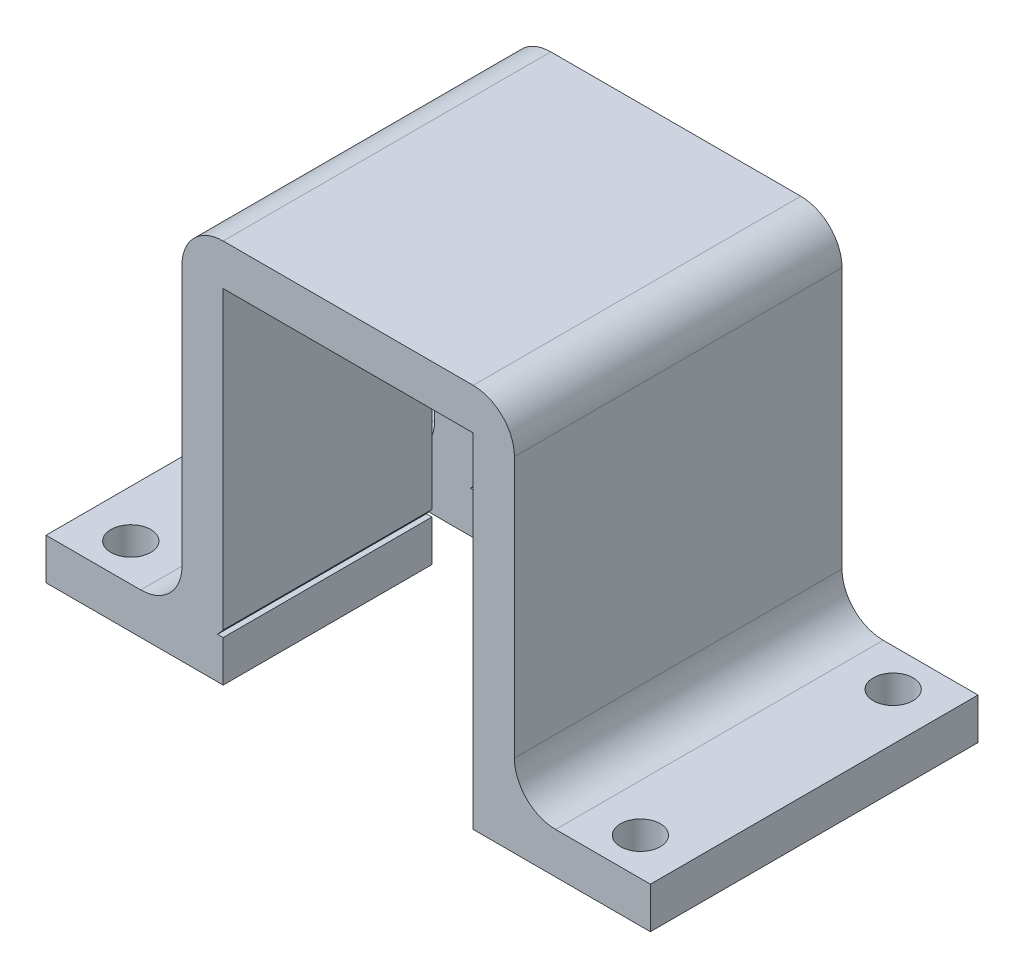
ISO-10303-21;
HEADER;
FILE_DESCRIPTION(('STEP AP214'),'2;1');
FILE_NAME('part.step','',(''),(''),'','','');
FILE_SCHEMA(('AUTOMOTIVE_DESIGN { 1 0 10303 214 1 1 1 1 }'));
ENDSEC;
DATA;
#1=APPLICATION_CONTEXT('core data for automotive mechanical design processes');
#2=APPLICATION_PROTOCOL_DEFINITION('international standard','automotive_design',2000,#1);
#3=PRODUCT_CONTEXT('',#1,'mechanical');
#4=PRODUCT('Part','Part','',(#3));
#5=PRODUCT_RELATED_PRODUCT_CATEGORY('part','',(#4));
#6=PRODUCT_DEFINITION_FORMATION('','',#4);
#7=PRODUCT_DEFINITION_CONTEXT('part definition',#1,'design');
#8=PRODUCT_DEFINITION('design','',#6,#7);
#9=PRODUCT_DEFINITION_SHAPE('','',#8);
#10=(LENGTH_UNIT() NAMED_UNIT(*) SI_UNIT(.MILLI.,.METRE.));
#11=(NAMED_UNIT(*) PLANE_ANGLE_UNIT() SI_UNIT($,.RADIAN.));
#12=(NAMED_UNIT(*) SI_UNIT($,.STERADIAN.) SOLID_ANGLE_UNIT());
#13=UNCERTAINTY_MEASURE_WITH_UNIT(LENGTH_MEASURE(1.E-05),#10,'distance_accuracy_value','');
#14=(GEOMETRIC_REPRESENTATION_CONTEXT(3) GLOBAL_UNCERTAINTY_ASSIGNED_CONTEXT((#13)) GLOBAL_UNIT_ASSIGNED_CONTEXT((#10,
#11,#12)) REPRESENTATION_CONTEXT('',''));
#15=CARTESIAN_POINT('',(0.,0.,0.));
#16=DIRECTION('',(0.,0.,1.));
#17=DIRECTION('',(1.,0.,0.));
#18=AXIS2_PLACEMENT_3D('',#15,#16,#17);
#19=CARTESIAN_POINT('',(0.,-11.,23.85));
#20=DIRECTION('',(0.,1.,0.));
#21=DIRECTION('',(-1.,0.,0.));
#22=AXIS2_PLACEMENT_3D('',#19,#20,#21);
#23=PLANE('',#22);
#24=DIRECTION('',(0.,0.,-1.));
#25=VECTOR('',#24,1.);
#26=CARTESIAN_POINT('',(-9.50714285714286,-11.,23.85));
#27=LINE('',#26,#25);
#28=CARTESIAN_POINT('',(-9.50714285714286,-11.,5.45));
#29=VERTEX_POINT('',#28);
#30=CARTESIAN_POINT('',(-9.50714285714286,-11.,0.));
#31=VERTEX_POINT('',#30);
#32=EDGE_CURVE('E367',#29,#31,#27,.T.);
#33=ORIENTED_EDGE('',*,*,#32,.F.);
#34=DIRECTION('',(1.,0.,0.));
#35=VECTOR('',#34,1.);
#36=CARTESIAN_POINT('',(0.,-11.,5.45));
#37=LINE('',#36,#35);
#38=CARTESIAN_POINT('',(-9.1,-11.,5.45));
#39=VERTEX_POINT('',#38);
#40=EDGE_CURVE('E611',#29,#39,#37,.T.);
#41=ORIENTED_EDGE('',*,*,#40,.T.);
#42=DIRECTION('',(0.,0.,-1.));
#43=VECTOR('',#42,1.);
#44=CARTESIAN_POINT('',(-9.1,-11.,23.85));
#45=LINE('',#44,#43);
#46=CARTESIAN_POINT('',(-9.1,-11.,0.));
#47=VERTEX_POINT('',#46);
#48=EDGE_CURVE('E138',#39,#47,#45,.T.);
#49=ORIENTED_EDGE('',*,*,#48,.T.);
#50=DIRECTION('',(1.,0.,0.));
#51=VECTOR('',#50,1.);
#52=CARTESIAN_POINT('',(0.,-11.,0.));
#53=LINE('',#52,#51);
#54=EDGE_CURVE('E234',#31,#47,#53,.T.);
#55=ORIENTED_EDGE('',*,*,#54,.F.);
#56=EDGE_LOOP('',(#33,#41,#49,#55));
#57=FACE_BOUND('',#56,.T.);
#58=ADVANCED_FACE('F47',(#57),#23,.T.);
#59=CARTESIAN_POINT('',(-9.1,-11.,23.85));
#60=VERTEX_POINT('',#59);
#61=CARTESIAN_POINT('',(-9.1,-11.,8.65000000000001));
#62=VERTEX_POINT('',#61);
#63=EDGE_CURVE('E70',#60,#62,#45,.T.);
#64=ORIENTED_EDGE('',*,*,#63,.T.);
#65=DIRECTION('',(-1.,0.,0.));
#66=VECTOR('',#65,1.);
#67=CARTESIAN_POINT('',(0.,-11.,8.65000000000001));
#68=LINE('',#67,#66);
#69=CARTESIAN_POINT('',(-9.50714285714286,-11.,8.65000000000001));
#70=VERTEX_POINT('',#69);
#71=EDGE_CURVE('E62',#62,#70,#68,.T.);
#72=ORIENTED_EDGE('',*,*,#71,.T.);
#73=CARTESIAN_POINT('',(-9.50714285714286,-11.,23.85));
#74=VERTEX_POINT('',#73);
#75=EDGE_CURVE('E145',#74,#70,#27,.T.);
#76=ORIENTED_EDGE('',*,*,#75,.F.);
#77=DIRECTION('',(1.,0.,0.));
#78=VECTOR('',#77,1.);
#79=CARTESIAN_POINT('',(0.,-11.,23.85));
#80=LINE('',#79,#78);
#81=EDGE_CURVE('E307',#74,#60,#80,.T.);
#82=ORIENTED_EDGE('',*,*,#81,.T.);
#83=EDGE_LOOP('',(#64,#72,#76,#82));
#84=FACE_BOUND('',#83,.T.);
#85=ADVANCED_FACE('F426',(#84),#23,.T.);
#86=CARTESIAN_POINT('',(0.,0.,23.85));
#87=DIRECTION('',(-0.756579928934907,0.65390122429374,0.));
#88=DIRECTION('',(-0.65390122429374,-0.756579928934907,0.));
#89=AXIS2_PLACEMENT_3D('',#86,#87,#88);
#90=PLANE('',#89);
#91=DIRECTION('',(0.65390122429374,0.756579928934907,0.));
#92=VECTOR('',#91,1.);
#93=CARTESIAN_POINT('',(0.,0.,5.45));
#94=LINE('',#93,#92);
#95=CARTESIAN_POINT('',(-9.1,-10.5289256198347,5.45));
#96=VERTEX_POINT('',#95);
#97=EDGE_CURVE('E420',#29,#96,#94,.T.);
#98=ORIENTED_EDGE('',*,*,#97,.F.);
#99=ORIENTED_EDGE('',*,*,#32,.T.);
#100=DIRECTION('',(0.65390122429374,0.756579928934906,0.));
#101=VECTOR('',#100,1.);
#102=CARTESIAN_POINT('',(0.,0.,0.));
#103=LINE('',#102,#101);
#104=CARTESIAN_POINT('',(-9.1,-10.5289256198347,0.));
#105=VERTEX_POINT('',#104);
#106=EDGE_CURVE('E237',#31,#105,#103,.T.);
#107=ORIENTED_EDGE('',*,*,#106,.T.);
#108=DIRECTION('',(0.,0.,-1.));
#109=VECTOR('',#108,1.);
#110=CARTESIAN_POINT('',(-9.1,-10.5289256198347,23.85));
#111=LINE('',#110,#109);
#112=EDGE_CURVE('E362',#96,#105,#111,.T.);
#113=ORIENTED_EDGE('',*,*,#112,.F.);
#114=EDGE_LOOP('',(#98,#99,#107,#113));
#115=FACE_BOUND('',#114,.T.);
#116=ADVANCED_FACE('F416',(#115),#90,.F.);
#117=DIRECTION('',(-0.65390122429374,-0.756579928934907,0.));
#118=VECTOR('',#117,1.);
#119=CARTESIAN_POINT('',(0.,0.,8.65));
#120=LINE('',#119,#118);
#121=CARTESIAN_POINT('',(-9.1,-10.5289256198347,8.65000000000001));
#122=VERTEX_POINT('',#121);
#123=EDGE_CURVE('E605',#122,#70,#120,.T.);
#124=ORIENTED_EDGE('',*,*,#123,.F.);
#125=CARTESIAN_POINT('',(-9.1,-10.5289256198347,23.85));
#126=VERTEX_POINT('',#125);
#127=EDGE_CURVE('E363',#126,#122,#111,.T.);
#128=ORIENTED_EDGE('',*,*,#127,.F.);
#129=DIRECTION('',(0.65390122429374,0.756579928934906,0.));
#130=VECTOR('',#129,1.);
#131=CARTESIAN_POINT('',(0.,0.,23.85));
#132=LINE('',#131,#130);
#133=EDGE_CURVE('E437',#74,#126,#132,.T.);
#134=ORIENTED_EDGE('',*,*,#133,.F.);
#135=ORIENTED_EDGE('',*,*,#75,.T.);
#136=EDGE_LOOP('',(#124,#128,#134,#135));
#137=FACE_BOUND('',#136,.T.);
#138=ADVANCED_FACE('F434',(#137),#90,.F.);
#139=CARTESIAN_POINT('',(-9.1,0.,23.85));
#140=DIRECTION('',(1.,0.,0.));
#141=DIRECTION('',(0.,1.,0.));
#142=AXIS2_PLACEMENT_3D('',#139,#140,#141);
#143=PLANE('',#142);
#144=DIRECTION('',(0.,0.,-1.));
#145=VECTOR('',#144,1.);
#146=CARTESIAN_POINT('',(-9.1,6.,23.85));
#147=LINE('',#146,#145);
#148=CARTESIAN_POINT('',(-9.1,6.,8.65));
#149=VERTEX_POINT('',#148);
#150=CARTESIAN_POINT('',(-9.1,6.,5.45));
#151=VERTEX_POINT('',#150);
#152=EDGE_CURVE('E489',#149,#151,#147,.T.);
#153=ORIENTED_EDGE('',*,*,#152,.T.);
#154=DIRECTION('',(0.,-1.,0.));
#155=VECTOR('',#154,1.);
#156=CARTESIAN_POINT('',(-9.1,0.,5.45));
#157=LINE('',#156,#155);
#158=EDGE_CURVE('E511',#151,#96,#157,.T.);
#159=ORIENTED_EDGE('',*,*,#158,.T.);
#160=ORIENTED_EDGE('',*,*,#112,.T.);
#161=DIRECTION('',(0.,-1.,0.));
#162=VECTOR('',#161,1.);
#163=CARTESIAN_POINT('',(-9.1,0.,0.));
#164=LINE('',#163,#162);
#165=CARTESIAN_POINT('',(-9.1,11.,0.));
#166=VERTEX_POINT('',#165);
#167=EDGE_CURVE('E242',#166,#105,#164,.T.);
#168=ORIENTED_EDGE('',*,*,#167,.F.);
#169=DIRECTION('',(0.,0.,-1.));
#170=VECTOR('',#169,1.);
#171=CARTESIAN_POINT('',(-9.1,11.,23.85));
#172=LINE('',#171,#170);
#173=CARTESIAN_POINT('',(-9.1,11.,23.85));
#174=VERTEX_POINT('',#173);
#175=EDGE_CURVE('E359',#174,#166,#172,.T.);
#176=ORIENTED_EDGE('',*,*,#175,.F.);
#177=DIRECTION('',(0.,-1.,0.));
#178=VECTOR('',#177,1.);
#179=CARTESIAN_POINT('',(-9.1,0.,23.85));
#180=LINE('',#179,#178);
#181=EDGE_CURVE('E544',#174,#126,#180,.T.);
#182=ORIENTED_EDGE('',*,*,#181,.T.);
#183=ORIENTED_EDGE('',*,*,#127,.T.);
#184=DIRECTION('',(0.,1.,0.));
#185=VECTOR('',#184,1.);
#186=CARTESIAN_POINT('',(-9.1,0.,8.65));
#187=LINE('',#186,#185);
#188=EDGE_CURVE('E598',#122,#149,#187,.T.);
#189=ORIENTED_EDGE('',*,*,#188,.T.);
#190=EDGE_LOOP('',(#153,#159,#160,#168,#176,#182,#183,#189));
#191=FACE_BOUND('',#190,.T.);
#192=ADVANCED_FACE('F615',(#191),#143,.T.);
#193=CARTESIAN_POINT('',(-12.1,0.,23.85));
#194=DIRECTION('',(1.,0.,0.));
#195=DIRECTION('',(0.,0.,-1.));
#196=AXIS2_PLACEMENT_3D('',#193,#194,#195);
#197=PLANE('',#196);
#198=DIRECTION('',(0.,-1.,0.));
#199=VECTOR('',#198,1.);
#200=CARTESIAN_POINT('',(-12.1,0.,5.45));
#201=LINE('',#200,#199);
#202=CARTESIAN_POINT('',(-12.1,6.,5.45));
#203=VERTEX_POINT('',#202);
#204=CARTESIAN_POINT('',(-12.1,-7.99999999999998,5.45));
#205=VERTEX_POINT('',#204);
#206=EDGE_CURVE('E481',#203,#205,#201,.T.);
#207=ORIENTED_EDGE('',*,*,#206,.F.);
#208=DIRECTION('',(0.,0.,-1.));
#209=VECTOR('',#208,1.);
#210=CARTESIAN_POINT('',(-12.1,6.,23.85));
#211=LINE('',#210,#209);
#212=CARTESIAN_POINT('',(-12.1,6.,8.65));
#213=VERTEX_POINT('',#212);
#214=EDGE_CURVE('E11',#213,#203,#211,.T.);
#215=ORIENTED_EDGE('',*,*,#214,.F.);
#216=DIRECTION('',(0.,1.,0.));
#217=VECTOR('',#216,1.);
#218=CARTESIAN_POINT('',(-12.1,0.,8.65));
#219=LINE('',#218,#217);
#220=CARTESIAN_POINT('',(-12.1,-7.99999999999998,8.65000000000001));
#221=VERTEX_POINT('',#220);
#222=EDGE_CURVE('E602',#221,#213,#219,.T.);
#223=ORIENTED_EDGE('',*,*,#222,.F.);
#224=DIRECTION('',(0.,0.,-1.));
#225=VECTOR('',#224,1.);
#226=CARTESIAN_POINT('',(-12.1,-7.99999999999998,23.85));
#227=LINE('',#226,#225);
#228=CARTESIAN_POINT('',(-12.1,-7.99999999999998,23.85));
#229=VERTEX_POINT('',#228);
#230=EDGE_CURVE('E322',#229,#221,#227,.T.);
#231=ORIENTED_EDGE('',*,*,#230,.F.);
#232=DIRECTION('',(0.,-1.,0.));
#233=VECTOR('',#232,1.);
#234=CARTESIAN_POINT('',(-12.1,0.,23.85));
#235=LINE('',#234,#233);
#236=CARTESIAN_POINT('',(-12.1,11.,23.85));
#237=VERTEX_POINT('',#236);
#238=EDGE_CURVE('E584',#237,#229,#235,.T.);
#239=ORIENTED_EDGE('',*,*,#238,.F.);
#240=DIRECTION('',(0.,0.,-1.));
#241=VECTOR('',#240,1.);
#242=CARTESIAN_POINT('',(-12.1,11.,23.85));
#243=LINE('',#242,#241);
#244=CARTESIAN_POINT('',(-12.1,11.,0.));
#245=VERTEX_POINT('',#244);
#246=EDGE_CURVE('E326',#237,#245,#243,.T.);
#247=ORIENTED_EDGE('',*,*,#246,.T.);
#248=DIRECTION('',(0.,-1.,0.));
#249=VECTOR('',#248,1.);
#250=CARTESIAN_POINT('',(-12.1,0.,0.));
#251=LINE('',#250,#249);
#252=CARTESIAN_POINT('',(-12.1,-7.99999999999998,0.));
#253=VERTEX_POINT('',#252);
#254=EDGE_CURVE('E283',#245,#253,#251,.T.);
#255=ORIENTED_EDGE('',*,*,#254,.T.);
#256=EDGE_CURVE('E321',#205,#253,#227,.T.);
#257=ORIENTED_EDGE('',*,*,#256,.F.);
#258=EDGE_LOOP('',(#207,#215,#223,#231,#239,#247,#255,#257));
#259=FACE_BOUND('',#258,.T.);
#260=ADVANCED_FACE('F497',(#259),#197,.F.);
#261=CARTESIAN_POINT('',(-15.1,-8.,23.85));
#262=DIRECTION('',(0.,0.,-1.));
#263=DIRECTION('',(-1.,0.,0.));
#264=AXIS2_PLACEMENT_3D('',#261,#262,#263);
#265=CYLINDRICAL_SURFACE('',#264,3.);
#266=CARTESIAN_POINT('',(-15.1,-8.,5.45));
#267=DIRECTION('',(0.,0.,1.));
#268=DIRECTION('',(0.,-1.,0.));
#269=AXIS2_PLACEMENT_3D('',#266,#267,#268);
#270=CIRCLE('',#269,3.);
#271=CARTESIAN_POINT('',(-15.1,-11.,5.45));
#272=VERTEX_POINT('',#271);
#273=EDGE_CURVE('E477',#205,#272,#270,.F.);
#274=ORIENTED_EDGE('',*,*,#273,.F.);
#275=ORIENTED_EDGE('',*,*,#256,.T.);
#276=CARTESIAN_POINT('',(-15.1,-8.,0.));
#277=DIRECTION('',(0.,0.,1.));
#278=DIRECTION('',(1.,0.,0.));
#279=AXIS2_PLACEMENT_3D('',#276,#277,#278);
#280=CIRCLE('',#279,3.);
#281=CARTESIAN_POINT('',(-15.1,-11.,0.));
#282=VERTEX_POINT('',#281);
#283=EDGE_CURVE('E287',#253,#282,#280,.F.);
#284=ORIENTED_EDGE('',*,*,#283,.T.);
#285=DIRECTION('',(0.,0.,-1.));
#286=VECTOR('',#285,1.);
#287=CARTESIAN_POINT('',(-15.1,-11.,23.85));
#288=LINE('',#287,#286);
#289=EDGE_CURVE('E316',#272,#282,#288,.T.);
#290=ORIENTED_EDGE('',*,*,#289,.F.);
#291=EDGE_LOOP('',(#274,#275,#284,#290));
#292=FACE_BOUND('',#291,.T.);
#293=ADVANCED_FACE('F493',(#292),#265,.F.);
#294=CARTESIAN_POINT('',(-15.1,-8.,8.65000000000001));
#295=DIRECTION('',(0.,0.,-1.));
#296=DIRECTION('',(0.,1.,0.));
#297=AXIS2_PLACEMENT_3D('',#294,#295,#296);
#298=CIRCLE('',#297,3.);
#299=CARTESIAN_POINT('',(-15.1,-11.,8.65000000000001));
#300=VERTEX_POINT('',#299);
#301=EDGE_CURVE('E597',#300,#221,#298,.F.);
#302=ORIENTED_EDGE('',*,*,#301,.F.);
#303=CARTESIAN_POINT('',(-15.1,-11.,23.85));
#304=VERTEX_POINT('',#303);
#305=EDGE_CURVE('E317',#304,#300,#288,.T.);
#306=ORIENTED_EDGE('',*,*,#305,.F.);
#307=CARTESIAN_POINT('',(-15.1,-8.,23.85));
#308=DIRECTION('',(0.,0.,1.));
#309=DIRECTION('',(1.,0.,0.));
#310=AXIS2_PLACEMENT_3D('',#307,#308,#309);
#311=CIRCLE('',#310,3.);
#312=EDGE_CURVE('E587',#229,#304,#311,.F.);
#313=ORIENTED_EDGE('',*,*,#312,.F.);
#314=ORIENTED_EDGE('',*,*,#230,.T.);
#315=EDGE_LOOP('',(#302,#306,#313,#314));
#316=FACE_BOUND('',#315,.T.);
#317=ADVANCED_FACE('F683',(#316),#265,.F.);
#318=CARTESIAN_POINT('',(0.,-11.,23.85));
#319=DIRECTION('',(0.,1.,0.));
#320=DIRECTION('',(-1.,0.,0.));
#321=AXIS2_PLACEMENT_3D('',#318,#319,#320);
#322=PLANE('',#321);
#323=CARTESIAN_POINT('',(-18.55,-11.,2.72499999999999));
#324=DIRECTION('',(0.,1.,0.));
#325=DIRECTION('',(1.,0.,0.));
#326=AXIS2_PLACEMENT_3D('',#323,#324,#325);
#327=CIRCLE('',#326,1.45);
#328=CARTESIAN_POINT('',(-17.1,-11.,2.72499999999999));
#329=VERTEX_POINT('',#328);
#330=EDGE_CURVE('E526',#329,#329,#327,.T.);
#331=ORIENTED_EDGE('',*,*,#330,.F.);
#332=EDGE_LOOP('',(#331));
#333=FACE_BOUND('',#332,.T.);
#334=DIRECTION('',(0.,0.,-1.));
#335=VECTOR('',#334,1.);
#336=CARTESIAN_POINT('',(-22.,-11.,23.85));
#337=LINE('',#336,#335);
#338=CARTESIAN_POINT('',(-22.,-11.,5.45000000000001));
#339=VERTEX_POINT('',#338);
#340=CARTESIAN_POINT('',(-22.,-11.,0.));
#341=VERTEX_POINT('',#340);
#342=EDGE_CURVE('E221',#339,#341,#337,.T.);
#343=ORIENTED_EDGE('',*,*,#342,.F.);
#344=DIRECTION('',(1.,0.,0.));
#345=VECTOR('',#344,1.);
#346=CARTESIAN_POINT('',(0.,-11.,5.45));
#347=LINE('',#346,#345);
#348=EDGE_CURVE('E495',#339,#272,#347,.T.);
#349=ORIENTED_EDGE('',*,*,#348,.T.);
#350=ORIENTED_EDGE('',*,*,#289,.T.);
#351=DIRECTION('',(1.,0.,0.));
#352=VECTOR('',#351,1.);
#353=CARTESIAN_POINT('',(0.,-11.,0.));
#354=LINE('',#353,#352);
#355=EDGE_CURVE('E291',#341,#282,#354,.T.);
#356=ORIENTED_EDGE('',*,*,#355,.F.);
#357=EDGE_LOOP('',(#343,#349,#350,#356));
#358=FACE_BOUND('',#357,.T.);
#359=ADVANCED_FACE('F507',(#333,#358),#322,.T.);
#360=CARTESIAN_POINT('',(-18.55,-11.,21.125));
#361=DIRECTION('',(0.,1.,0.));
#362=DIRECTION('',(-1.,0.,0.));
#363=AXIS2_PLACEMENT_3D('',#360,#361,#362);
#364=CIRCLE('',#363,1.45);
#365=CARTESIAN_POINT('',(-20.,-11.,21.125));
#366=VERTEX_POINT('',#365);
#367=EDGE_CURVE('E376',#366,#366,#364,.T.);
#368=ORIENTED_EDGE('',*,*,#367,.F.);
#369=EDGE_LOOP('',(#368));
#370=FACE_BOUND('',#369,.T.);
#371=ORIENTED_EDGE('',*,*,#305,.T.);
#372=DIRECTION('',(-1.,0.,0.));
#373=VECTOR('',#372,1.);
#374=CARTESIAN_POINT('',(0.,-11.,8.65000000000001));
#375=LINE('',#374,#373);
#376=CARTESIAN_POINT('',(-22.,-11.,8.65000000000001));
#377=VERTEX_POINT('',#376);
#378=EDGE_CURVE('E594',#300,#377,#375,.T.);
#379=ORIENTED_EDGE('',*,*,#378,.T.);
#380=CARTESIAN_POINT('',(-22.,-11.,23.85));
#381=VERTEX_POINT('',#380);
#382=EDGE_CURVE('E313',#381,#377,#337,.T.);
#383=ORIENTED_EDGE('',*,*,#382,.F.);
#384=DIRECTION('',(1.,0.,0.));
#385=VECTOR('',#384,1.);
#386=CARTESIAN_POINT('',(0.,-11.,23.85));
#387=LINE('',#386,#385);
#388=EDGE_CURVE('E206',#381,#304,#387,.T.);
#389=ORIENTED_EDGE('',*,*,#388,.T.);
#390=EDGE_LOOP('',(#371,#379,#383,#389));
#391=FACE_BOUND('',#390,.T.);
#392=ADVANCED_FACE('F591',(#370,#391),#322,.T.);
#393=CARTESIAN_POINT('',(-22.,0.,23.85));
#394=DIRECTION('',(1.,0.,0.));
#395=DIRECTION('',(0.,0.,-1.));
#396=AXIS2_PLACEMENT_3D('',#393,#394,#395);
#397=PLANE('',#396);
#398=DIRECTION('',(0.,-1.,0.));
#399=VECTOR('',#398,1.);
#400=CARTESIAN_POINT('',(-22.,6.,5.45));
#401=LINE('',#400,#399);
#402=CARTESIAN_POINT('',(-22.,-14.,5.45000000000001));
#403=VERTEX_POINT('',#402);
#404=EDGE_CURVE('E990',#339,#403,#401,.T.);
#405=ORIENTED_EDGE('',*,*,#404,.F.);
#406=ORIENTED_EDGE('',*,*,#342,.T.);
#407=DIRECTION('',(0.,-1.,0.));
#408=VECTOR('',#407,1.);
#409=CARTESIAN_POINT('',(-22.,0.,0.));
#410=LINE('',#409,#408);
#411=CARTESIAN_POINT('',(-22.,-14.,0.));
#412=VERTEX_POINT('',#411);
#413=EDGE_CURVE('E295',#341,#412,#410,.T.);
#414=ORIENTED_EDGE('',*,*,#413,.T.);
#415=DIRECTION('',(0.,0.,-1.));
#416=VECTOR('',#415,1.);
#417=CARTESIAN_POINT('',(-22.,-14.,23.85));
#418=LINE('',#417,#416);
#419=EDGE_CURVE('E222',#403,#412,#418,.T.);
#420=ORIENTED_EDGE('',*,*,#419,.F.);
#421=EDGE_LOOP('',(#405,#406,#414,#420));
#422=FACE_BOUND('',#421,.T.);
#423=ADVANCED_FACE('F795',(#422),#397,.F.);
#424=DIRECTION('',(0.,1.,0.));
#425=VECTOR('',#424,1.);
#426=CARTESIAN_POINT('',(-22.,6.,8.65));
#427=LINE('',#426,#425);
#428=CARTESIAN_POINT('',(-22.,-14.,8.65000000000001));
#429=VERTEX_POINT('',#428);
#430=EDGE_CURVE('E217',#429,#377,#427,.T.);
#431=ORIENTED_EDGE('',*,*,#430,.F.);
#432=CARTESIAN_POINT('',(-22.,-14.,23.85));
#433=VERTEX_POINT('',#432);
#434=EDGE_CURVE('E213',#433,#429,#418,.T.);
#435=ORIENTED_EDGE('',*,*,#434,.F.);
#436=DIRECTION('',(0.,-1.,0.));
#437=VECTOR('',#436,1.);
#438=CARTESIAN_POINT('',(-22.,0.,23.85));
#439=LINE('',#438,#437);
#440=EDGE_CURVE('E197',#381,#433,#439,.T.);
#441=ORIENTED_EDGE('',*,*,#440,.F.);
#442=ORIENTED_EDGE('',*,*,#382,.T.);
#443=EDGE_LOOP('',(#431,#435,#441,#442));
#444=FACE_BOUND('',#443,.T.);
#445=ADVANCED_FACE('F214',(#444),#397,.F.);
#446=CARTESIAN_POINT('',(0.,-14.,23.85));
#447=DIRECTION('',(0.,1.,0.));
#448=DIRECTION('',(-1.,0.,0.));
#449=AXIS2_PLACEMENT_3D('',#446,#447,#448);
#450=PLANE('',#449);
#451=CARTESIAN_POINT('',(-18.55,-14.,2.72499999999999));
#452=DIRECTION('',(0.,1.,0.));
#453=DIRECTION('',(-1.,0.,0.));
#454=AXIS2_PLACEMENT_3D('',#451,#452,#453);
#455=CIRCLE('',#454,1.45);
#456=CARTESIAN_POINT('',(-20.,-14.,2.72499999999999));
#457=VERTEX_POINT('',#456);
#458=EDGE_CURVE('E375',#457,#457,#455,.T.);
#459=ORIENTED_EDGE('',*,*,#458,.T.);
#460=EDGE_LOOP('',(#459));
#461=FACE_BOUND('',#460,.T.);
#462=DIRECTION('',(1.,0.,0.));
#463=VECTOR('',#462,1.);
#464=CARTESIAN_POINT('',(-22.,-14.,5.45000000000001));
#465=LINE('',#464,#463);
#466=CARTESIAN_POINT('',(-9.1,-14.,5.45000000000001));
#467=VERTEX_POINT('',#466);
#468=EDGE_CURVE('E401',#403,#467,#465,.T.);
#469=ORIENTED_EDGE('',*,*,#468,.F.);
#470=ORIENTED_EDGE('',*,*,#419,.T.);
#471=DIRECTION('',(1.,0.,0.));
#472=VECTOR('',#471,1.);
#473=CARTESIAN_POINT('',(0.,-14.,0.));
#474=LINE('',#473,#472);
#475=CARTESIAN_POINT('',(-9.1,-14.,0.));
#476=VERTEX_POINT('',#475);
#477=EDGE_CURVE('E299',#412,#476,#474,.T.);
#478=ORIENTED_EDGE('',*,*,#477,.T.);
#479=DIRECTION('',(0.,0.,-1.));
#480=VECTOR('',#479,1.);
#481=CARTESIAN_POINT('',(-9.1,-14.,23.85));
#482=LINE('',#481,#480);
#483=EDGE_CURVE('E310',#467,#476,#482,.T.);
#484=ORIENTED_EDGE('',*,*,#483,.F.);
#485=EDGE_LOOP('',(#469,#470,#478,#484));
#486=FACE_BOUND('',#485,.T.);
#487=ADVANCED_FACE('F399',(#461,#486),#450,.F.);
#488=CARTESIAN_POINT('',(-18.55,-14.,21.125));
#489=DIRECTION('',(0.,1.,0.));
#490=DIRECTION('',(-1.,0.,0.));
#491=AXIS2_PLACEMENT_3D('',#488,#489,#490);
#492=CIRCLE('',#491,1.45);
#493=CARTESIAN_POINT('',(-20.,-14.,21.125));
#494=VERTEX_POINT('',#493);
#495=EDGE_CURVE('E371',#494,#494,#492,.T.);
#496=ORIENTED_EDGE('',*,*,#495,.T.);
#497=EDGE_LOOP('',(#496));
#498=FACE_BOUND('',#497,.T.);
#499=DIRECTION('',(1.,0.,0.));
#500=VECTOR('',#499,1.);
#501=CARTESIAN_POINT('',(-22.,-14.,8.65000000000001));
#502=LINE('',#501,#500);
#503=CARTESIAN_POINT('',(-9.1,-14.,8.65000000000001));
#504=VERTEX_POINT('',#503);
#505=EDGE_CURVE('E625',#429,#504,#502,.T.);
#506=ORIENTED_EDGE('',*,*,#505,.T.);
#507=CARTESIAN_POINT('',(-9.1,-14.,23.85));
#508=VERTEX_POINT('',#507);
#509=EDGE_CURVE('E226',#508,#504,#482,.T.);
#510=ORIENTED_EDGE('',*,*,#509,.F.);
#511=DIRECTION('',(1.,0.,0.));
#512=VECTOR('',#511,1.);
#513=CARTESIAN_POINT('',(0.,-14.,23.85));
#514=LINE('',#513,#512);
#515=EDGE_CURVE('E203',#433,#508,#514,.T.);
#516=ORIENTED_EDGE('',*,*,#515,.F.);
#517=ORIENTED_EDGE('',*,*,#434,.T.);
#518=EDGE_LOOP('',(#506,#510,#516,#517));
#519=FACE_BOUND('',#518,.T.);
#520=ADVANCED_FACE('F224',(#498,#519),#450,.F.);
#521=CARTESIAN_POINT('',(-9.1,0.,23.85));
#522=DIRECTION('',(1.,0.,0.));
#523=DIRECTION('',(0.,0.,-1.));
#524=AXIS2_PLACEMENT_3D('',#521,#522,#523);
#525=PLANE('',#524);
#526=ORIENTED_EDGE('',*,*,#48,.F.);
#527=DIRECTION('',(0.,-1.,0.));
#528=VECTOR('',#527,1.);
#529=CARTESIAN_POINT('',(-9.1,0.,5.45));
#530=LINE('',#529,#528);
#531=EDGE_CURVE('E55',#39,#467,#530,.T.);
#532=ORIENTED_EDGE('',*,*,#531,.T.);
#533=ORIENTED_EDGE('',*,*,#483,.T.);
#534=DIRECTION('',(0.,-1.,0.));
#535=VECTOR('',#534,1.);
#536=CARTESIAN_POINT('',(-9.1,0.,0.));
#537=LINE('',#536,#535);
#538=EDGE_CURVE('E303',#47,#476,#537,.T.);
#539=ORIENTED_EDGE('',*,*,#538,.F.);
#540=EDGE_LOOP('',(#526,#532,#533,#539));
#541=FACE_BOUND('',#540,.T.);
#542=ADVANCED_FACE('F388',(#541),#525,.T.);
#543=ORIENTED_EDGE('',*,*,#509,.T.);
#544=DIRECTION('',(0.,1.,0.));
#545=VECTOR('',#544,1.);
#546=CARTESIAN_POINT('',(-9.1,0.,8.65));
#547=LINE('',#546,#545);
#548=EDGE_CURVE('E370',#504,#62,#547,.T.);
#549=ORIENTED_EDGE('',*,*,#548,.T.);
#550=ORIENTED_EDGE('',*,*,#63,.F.);
#551=DIRECTION('',(0.,-1.,0.));
#552=VECTOR('',#551,1.);
#553=CARTESIAN_POINT('',(-9.1,0.,23.85));
#554=LINE('',#553,#552);
#555=EDGE_CURVE('E228',#60,#508,#554,.T.);
#556=ORIENTED_EDGE('',*,*,#555,.T.);
#557=EDGE_LOOP('',(#543,#549,#550,#556));
#558=FACE_BOUND('',#557,.T.);
#559=ADVANCED_FACE('F439',(#558),#525,.T.);
#560=CARTESIAN_POINT('',(0.,11.,23.85));
#561=DIRECTION('',(0.,1.,0.));
#562=DIRECTION('',(0.,0.,1.));
#563=AXIS2_PLACEMENT_3D('',#560,#561,#562);
#564=PLANE('',#563);
#565=DIRECTION('',(1.,0.,0.));
#566=VECTOR('',#565,1.);
#567=CARTESIAN_POINT('',(0.,11.,0.));
#568=LINE('',#567,#566);
#569=CARTESIAN_POINT('',(9.1,11.,0.));
#570=VERTEX_POINT('',#569);
#571=EDGE_CURVE('E246',#166,#570,#568,.T.);
#572=ORIENTED_EDGE('',*,*,#571,.T.);
#573=DIRECTION('',(0.,0.,-1.));
#574=VECTOR('',#573,1.);
#575=CARTESIAN_POINT('',(9.1,11.,23.85));
#576=LINE('',#575,#574);
#577=CARTESIAN_POINT('',(9.1,11.,23.85));
#578=VERTEX_POINT('',#577);
#579=EDGE_CURVE('E355',#578,#570,#576,.T.);
#580=ORIENTED_EDGE('',*,*,#579,.F.);
#581=DIRECTION('',(1.,0.,0.));
#582=VECTOR('',#581,1.);
#583=CARTESIAN_POINT('',(0.,11.,23.85));
#584=LINE('',#583,#582);
#585=EDGE_CURVE('E548',#174,#578,#584,.T.);
#586=ORIENTED_EDGE('',*,*,#585,.F.);
#587=ORIENTED_EDGE('',*,*,#175,.T.);
#588=EDGE_LOOP('',(#572,#580,#586,#587));
#589=FACE_BOUND('',#588,.T.);
#590=ADVANCED_FACE('F645',(#589),#564,.F.);
#591=CARTESIAN_POINT('',(9.1,0.,23.85));
#592=DIRECTION('',(1.,0.,0.));
#593=DIRECTION('',(0.,0.,-1.));
#594=AXIS2_PLACEMENT_3D('',#591,#592,#593);
#595=PLANE('',#594);
#596=DIRECTION('',(0.,-1.,0.));
#597=VECTOR('',#596,1.);
#598=CARTESIAN_POINT('',(9.1,0.,0.));
#599=LINE('',#598,#597);
#600=CARTESIAN_POINT('',(9.1,-14.,0.));
#601=VERTEX_POINT('',#600);
#602=EDGE_CURVE('E249',#570,#601,#599,.T.);
#603=ORIENTED_EDGE('',*,*,#602,.T.);
#604=DIRECTION('',(0.,0.,-1.));
#605=VECTOR('',#604,1.);
#606=CARTESIAN_POINT('',(9.1,-14.,23.85));
#607=LINE('',#606,#605);
#608=CARTESIAN_POINT('',(9.1,-14.,23.85));
#609=VERTEX_POINT('',#608);
#610=EDGE_CURVE('E351',#609,#601,#607,.T.);
#611=ORIENTED_EDGE('',*,*,#610,.F.);
#612=DIRECTION('',(0.,-1.,0.));
#613=VECTOR('',#612,1.);
#614=CARTESIAN_POINT('',(9.1,0.,23.85));
#615=LINE('',#614,#613);
#616=EDGE_CURVE('E551',#578,#609,#615,.T.);
#617=ORIENTED_EDGE('',*,*,#616,.F.);
#618=ORIENTED_EDGE('',*,*,#579,.T.);
#619=EDGE_LOOP('',(#603,#611,#617,#618));
#620=FACE_BOUND('',#619,.T.);
#621=ADVANCED_FACE('F648',(#620),#595,.F.);
#622=CARTESIAN_POINT('',(0.,-14.,23.85));
#623=DIRECTION('',(0.,1.,0.));
#624=DIRECTION('',(0.,0.,1.));
#625=AXIS2_PLACEMENT_3D('',#622,#623,#624);
#626=PLANE('',#625);
#627=CARTESIAN_POINT('',(18.55,-14.,21.125));
#628=DIRECTION('',(0.,1.,0.));
#629=DIRECTION('',(0.,0.,1.));
#630=AXIS2_PLACEMENT_3D('',#627,#628,#629);
#631=CIRCLE('',#630,1.45);
#632=CARTESIAN_POINT('',(18.55,-14.,22.575));
#633=VERTEX_POINT('',#632);
#634=EDGE_CURVE('E238',#633,#633,#631,.T.);
#635=ORIENTED_EDGE('',*,*,#634,.T.);
#636=EDGE_LOOP('',(#635));
#637=FACE_BOUND('',#636,.T.);
#638=CARTESIAN_POINT('',(18.55,-14.,2.72499999999999));
#639=DIRECTION('',(0.,1.,0.));
#640=DIRECTION('',(0.,0.,1.));
#641=AXIS2_PLACEMENT_3D('',#638,#639,#640);
#642=CIRCLE('',#641,1.45);
#643=CARTESIAN_POINT('',(18.55,-14.,4.17499999999999));
#644=VERTEX_POINT('',#643);
#645=EDGE_CURVE('E380',#644,#644,#642,.T.);
#646=ORIENTED_EDGE('',*,*,#645,.T.);
#647=EDGE_LOOP('',(#646));
#648=FACE_BOUND('',#647,.T.);
#649=DIRECTION('',(1.,0.,0.));
#650=VECTOR('',#649,1.);
#651=CARTESIAN_POINT('',(0.,-14.,0.));
#652=LINE('',#651,#650);
#653=CARTESIAN_POINT('',(22.,-14.,0.));
#654=VERTEX_POINT('',#653);
#655=EDGE_CURVE('E252',#601,#654,#652,.T.);
#656=ORIENTED_EDGE('',*,*,#655,.T.);
#657=DIRECTION('',(0.,0.,-1.));
#658=VECTOR('',#657,1.);
#659=CARTESIAN_POINT('',(22.,-14.,23.85));
#660=LINE('',#659,#658);
#661=CARTESIAN_POINT('',(22.,-14.,23.85));
#662=VERTEX_POINT('',#661);
#663=EDGE_CURVE('E348',#662,#654,#660,.T.);
#664=ORIENTED_EDGE('',*,*,#663,.F.);
#665=DIRECTION('',(1.,0.,0.));
#666=VECTOR('',#665,1.);
#667=CARTESIAN_POINT('',(0.,-14.,23.85));
#668=LINE('',#667,#666);
#669=EDGE_CURVE('E554',#609,#662,#668,.T.);
#670=ORIENTED_EDGE('',*,*,#669,.F.);
#671=ORIENTED_EDGE('',*,*,#610,.T.);
#672=EDGE_LOOP('',(#656,#664,#670,#671));
#673=FACE_BOUND('',#672,.T.);
#674=ADVANCED_FACE('F653',(#637,#648,#673),#626,.F.);
#675=CARTESIAN_POINT('',(22.,0.,23.85));
#676=DIRECTION('',(1.,0.,0.));
#677=DIRECTION('',(0.,1.,0.));
#678=AXIS2_PLACEMENT_3D('',#675,#676,#677);
#679=PLANE('',#678);
#680=DIRECTION('',(0.,-1.,0.));
#681=VECTOR('',#680,1.);
#682=CARTESIAN_POINT('',(22.,0.,0.));
#683=LINE('',#682,#681);
#684=CARTESIAN_POINT('',(22.,-11.,0.));
#685=VERTEX_POINT('',#684);
#686=EDGE_CURVE('E256',#685,#654,#683,.T.);
#687=ORIENTED_EDGE('',*,*,#686,.F.);
#688=DIRECTION('',(0.,0.,-1.));
#689=VECTOR('',#688,1.);
#690=CARTESIAN_POINT('',(22.,-11.,23.85));
#691=LINE('',#690,#689);
#692=CARTESIAN_POINT('',(22.,-11.,23.85));
#693=VERTEX_POINT('',#692);
#694=EDGE_CURVE('E345',#693,#685,#691,.T.);
#695=ORIENTED_EDGE('',*,*,#694,.F.);
#696=DIRECTION('',(0.,-1.,0.));
#697=VECTOR('',#696,1.);
#698=CARTESIAN_POINT('',(22.,0.,23.85));
#699=LINE('',#698,#697);
#700=EDGE_CURVE('E557',#693,#662,#699,.T.);
#701=ORIENTED_EDGE('',*,*,#700,.T.);
#702=ORIENTED_EDGE('',*,*,#663,.T.);
#703=EDGE_LOOP('',(#687,#695,#701,#702));
#704=FACE_BOUND('',#703,.T.);
#705=ADVANCED_FACE('F708',(#704),#679,.T.);
#706=CARTESIAN_POINT('',(0.,-11.,23.85));
#707=DIRECTION('',(0.,1.,0.));
#708=DIRECTION('',(-1.,0.,0.));
#709=AXIS2_PLACEMENT_3D('',#706,#707,#708);
#710=PLANE('',#709);
#711=CARTESIAN_POINT('',(18.55,-11.,21.125));
#712=DIRECTION('',(0.,1.,0.));
#713=DIRECTION('',(1.,0.,0.));
#714=AXIS2_PLACEMENT_3D('',#711,#712,#713);
#715=CIRCLE('',#714,1.45);
#716=CARTESIAN_POINT('',(20.,-11.,21.125));
#717=VERTEX_POINT('',#716);
#718=EDGE_CURVE('E525',#717,#717,#715,.T.);
#719=ORIENTED_EDGE('',*,*,#718,.F.);
#720=EDGE_LOOP('',(#719));
#721=FACE_BOUND('',#720,.T.);
#722=CARTESIAN_POINT('',(18.55,-11.,2.72499999999999));
#723=DIRECTION('',(0.,1.,0.));
#724=DIRECTION('',(-1.,0.,0.));
#725=AXIS2_PLACEMENT_3D('',#722,#723,#724);
#726=CIRCLE('',#725,1.45);
#727=CARTESIAN_POINT('',(17.1,-11.,2.72499999999999));
#728=VERTEX_POINT('',#727);
#729=EDGE_CURVE('E521',#728,#728,#726,.T.);
#730=ORIENTED_EDGE('',*,*,#729,.F.);
#731=EDGE_LOOP('',(#730));
#732=FACE_BOUND('',#731,.T.);
#733=DIRECTION('',(1.,0.,0.));
#734=VECTOR('',#733,1.);
#735=CARTESIAN_POINT('',(0.,-11.,0.));
#736=LINE('',#735,#734);
#737=CARTESIAN_POINT('',(15.1,-11.,0.));
#738=VERTEX_POINT('',#737);
#739=EDGE_CURVE('E260',#738,#685,#736,.T.);
#740=ORIENTED_EDGE('',*,*,#739,.F.);
#741=DIRECTION('',(0.,0.,-1.));
#742=VECTOR('',#741,1.);
#743=CARTESIAN_POINT('',(15.1,-11.,23.85));
#744=LINE('',#743,#742);
#745=CARTESIAN_POINT('',(15.1,-11.,23.85));
#746=VERTEX_POINT('',#745);
#747=EDGE_CURVE('E342',#746,#738,#744,.T.);
#748=ORIENTED_EDGE('',*,*,#747,.F.);
#749=DIRECTION('',(1.,0.,0.));
#750=VECTOR('',#749,1.);
#751=CARTESIAN_POINT('',(0.,-11.,23.85));
#752=LINE('',#751,#750);
#753=EDGE_CURVE('E561',#746,#693,#752,.T.);
#754=ORIENTED_EDGE('',*,*,#753,.T.);
#755=ORIENTED_EDGE('',*,*,#694,.T.);
#756=EDGE_LOOP('',(#740,#748,#754,#755));
#757=FACE_BOUND('',#756,.T.);
#758=ADVANCED_FACE('F660',(#721,#732,#757),#710,.T.);
#759=CARTESIAN_POINT('',(15.1,-8.,23.85));
#760=DIRECTION('',(0.,0.,-1.));
#761=DIRECTION('',(-1.,0.,0.));
#762=AXIS2_PLACEMENT_3D('',#759,#760,#761);
#763=CYLINDRICAL_SURFACE('',#762,3.);
#764=CARTESIAN_POINT('',(15.1,-8.,0.));
#765=DIRECTION('',(0.,0.,1.));
#766=DIRECTION('',(1.,0.,0.));
#767=AXIS2_PLACEMENT_3D('',#764,#765,#766);
#768=CIRCLE('',#767,3.);
#769=CARTESIAN_POINT('',(12.1,-7.99999999999998,0.));
#770=VERTEX_POINT('',#769);
#771=EDGE_CURVE('E264',#770,#738,#768,.T.);
#772=ORIENTED_EDGE('',*,*,#771,.F.);
#773=DIRECTION('',(0.,0.,-1.));
#774=VECTOR('',#773,1.);
#775=CARTESIAN_POINT('',(12.1,-7.99999999999998,23.85));
#776=LINE('',#775,#774);
#777=CARTESIAN_POINT('',(12.1,-7.99999999999998,23.85));
#778=VERTEX_POINT('',#777);
#779=EDGE_CURVE('E339',#778,#770,#776,.T.);
#780=ORIENTED_EDGE('',*,*,#779,.F.);
#781=CARTESIAN_POINT('',(15.1,-8.,23.85));
#782=DIRECTION('',(0.,0.,1.));
#783=DIRECTION('',(1.,0.,0.));
#784=AXIS2_PLACEMENT_3D('',#781,#782,#783);
#785=CIRCLE('',#784,3.);
#786=EDGE_CURVE('E565',#778,#746,#785,.T.);
#787=ORIENTED_EDGE('',*,*,#786,.T.);
#788=ORIENTED_EDGE('',*,*,#747,.T.);
#789=EDGE_LOOP('',(#772,#780,#787,#788));
#790=FACE_BOUND('',#789,.T.);
#791=ADVANCED_FACE('F664',(#790),#763,.F.);
#792=CARTESIAN_POINT('',(12.1,0.,23.85));
#793=DIRECTION('',(1.,0.,0.));
#794=DIRECTION('',(0.,1.,0.));
#795=AXIS2_PLACEMENT_3D('',#792,#793,#794);
#796=PLANE('',#795);
#797=DIRECTION('',(0.,-1.,0.));
#798=VECTOR('',#797,1.);
#799=CARTESIAN_POINT('',(12.1,0.,0.));
#800=LINE('',#799,#798);
#801=CARTESIAN_POINT('',(12.1,11.,0.));
#802=VERTEX_POINT('',#801);
#803=EDGE_CURVE('E268',#802,#770,#800,.T.);
#804=ORIENTED_EDGE('',*,*,#803,.F.);
#805=DIRECTION('',(0.,0.,-1.));
#806=VECTOR('',#805,1.);
#807=CARTESIAN_POINT('',(12.1,11.,23.85));
#808=LINE('',#807,#806);
#809=CARTESIAN_POINT('',(12.1,11.,23.85));
#810=VERTEX_POINT('',#809);
#811=EDGE_CURVE('E336',#810,#802,#808,.T.);
#812=ORIENTED_EDGE('',*,*,#811,.F.);
#813=DIRECTION('',(0.,-1.,0.));
#814=VECTOR('',#813,1.);
#815=CARTESIAN_POINT('',(12.1,0.,23.85));
#816=LINE('',#815,#814);
#817=EDGE_CURVE('E569',#810,#778,#816,.T.);
#818=ORIENTED_EDGE('',*,*,#817,.T.);
#819=ORIENTED_EDGE('',*,*,#779,.T.);
#820=EDGE_LOOP('',(#804,#812,#818,#819));
#821=FACE_BOUND('',#820,.T.);
#822=ADVANCED_FACE('F669',(#821),#796,.T.);
#823=CARTESIAN_POINT('',(9.1,11.,23.85));
#824=DIRECTION('',(0.,0.,-1.));
#825=DIRECTION('',(-1.,0.,0.));
#826=AXIS2_PLACEMENT_3D('',#823,#824,#825);
#827=CYLINDRICAL_SURFACE('',#826,3.);
#828=CARTESIAN_POINT('',(9.1,11.,0.));
#829=DIRECTION('',(0.,0.,1.));
#830=DIRECTION('',(1.,0.,0.));
#831=AXIS2_PLACEMENT_3D('',#828,#829,#830);
#832=CIRCLE('',#831,3.);
#833=CARTESIAN_POINT('',(9.09999999999998,14.,0.));
#834=VERTEX_POINT('',#833);
#835=EDGE_CURVE('E272',#834,#802,#832,.F.);
#836=ORIENTED_EDGE('',*,*,#835,.F.);
#837=DIRECTION('',(0.,0.,-1.));
#838=VECTOR('',#837,1.);
#839=CARTESIAN_POINT('',(9.09999999999998,14.,23.85));
#840=LINE('',#839,#838);
#841=CARTESIAN_POINT('',(9.09999999999998,14.,23.85));
#842=VERTEX_POINT('',#841);
#843=EDGE_CURVE('E333',#842,#834,#840,.T.);
#844=ORIENTED_EDGE('',*,*,#843,.F.);
#845=CARTESIAN_POINT('',(9.1,11.,23.85));
#846=DIRECTION('',(0.,0.,1.));
#847=DIRECTION('',(1.,0.,0.));
#848=AXIS2_PLACEMENT_3D('',#845,#846,#847);
#849=CIRCLE('',#848,3.);
#850=EDGE_CURVE('E573',#842,#810,#849,.F.);
#851=ORIENTED_EDGE('',*,*,#850,.T.);
#852=ORIENTED_EDGE('',*,*,#811,.T.);
#853=EDGE_LOOP('',(#836,#844,#851,#852));
#854=FACE_BOUND('',#853,.T.);
#855=ADVANCED_FACE('F672',(#854),#827,.T.);
#856=CARTESIAN_POINT('',(0.,14.,23.85));
#857=DIRECTION('',(0.,1.,0.));
#858=DIRECTION('',(0.,0.,1.));
#859=AXIS2_PLACEMENT_3D('',#856,#857,#858);
#860=PLANE('',#859);
#861=DIRECTION('',(1.,0.,0.));
#862=VECTOR('',#861,1.);
#863=CARTESIAN_POINT('',(0.,14.,0.));
#864=LINE('',#863,#862);
#865=CARTESIAN_POINT('',(-9.09999999999998,14.,0.));
#866=VERTEX_POINT('',#865);
#867=EDGE_CURVE('E276',#866,#834,#864,.T.);
#868=ORIENTED_EDGE('',*,*,#867,.F.);
#869=DIRECTION('',(0.,0.,-1.));
#870=VECTOR('',#869,1.);
#871=CARTESIAN_POINT('',(-9.09999999999998,14.,23.85));
#872=LINE('',#871,#870);
#873=CARTESIAN_POINT('',(-9.09999999999998,14.,23.85));
#874=VERTEX_POINT('',#873);
#875=EDGE_CURVE('E330',#874,#866,#872,.T.);
#876=ORIENTED_EDGE('',*,*,#875,.F.);
#877=DIRECTION('',(1.,0.,0.));
#878=VECTOR('',#877,1.);
#879=CARTESIAN_POINT('',(0.,14.,23.85));
#880=LINE('',#879,#878);
#881=EDGE_CURVE('E577',#874,#842,#880,.T.);
#882=ORIENTED_EDGE('',*,*,#881,.T.);
#883=ORIENTED_EDGE('',*,*,#843,.T.);
#884=EDGE_LOOP('',(#868,#876,#882,#883));
#885=FACE_BOUND('',#884,.T.);
#886=ADVANCED_FACE('F676',(#885),#860,.T.);
#887=CARTESIAN_POINT('',(-9.1,11.,23.85));
#888=DIRECTION('',(0.,0.,-1.));
#889=DIRECTION('',(-1.,0.,0.));
#890=AXIS2_PLACEMENT_3D('',#887,#888,#889);
#891=CYLINDRICAL_SURFACE('',#890,3.);
#892=CARTESIAN_POINT('',(-9.1,11.,0.));
#893=DIRECTION('',(0.,0.,1.));
#894=DIRECTION('',(1.,0.,0.));
#895=AXIS2_PLACEMENT_3D('',#892,#893,#894);
#896=CIRCLE('',#895,3.);
#897=EDGE_CURVE('E280',#866,#245,#896,.T.);
#898=ORIENTED_EDGE('',*,*,#897,.T.);
#899=ORIENTED_EDGE('',*,*,#246,.F.);
#900=CARTESIAN_POINT('',(-9.1,11.,23.85));
#901=DIRECTION('',(0.,0.,1.));
#902=DIRECTION('',(1.,0.,0.));
#903=AXIS2_PLACEMENT_3D('',#900,#901,#902);
#904=CIRCLE('',#903,3.);
#905=EDGE_CURVE('E581',#874,#237,#904,.T.);
#906=ORIENTED_EDGE('',*,*,#905,.F.);
#907=ORIENTED_EDGE('',*,*,#875,.T.);
#908=EDGE_LOOP('',(#898,#899,#906,#907));
#909=FACE_BOUND('',#908,.T.);
#910=ADVANCED_FACE('F679',(#909),#891,.T.);
#911=CARTESIAN_POINT('',(0.,0.,23.85));
#912=DIRECTION('',(0.,0.,1.));
#913=DIRECTION('',(1.,0.,0.));
#914=AXIS2_PLACEMENT_3D('',#911,#912,#913);
#915=PLANE('',#914);
#916=ORIENTED_EDGE('',*,*,#81,.F.);
#917=ORIENTED_EDGE('',*,*,#133,.T.);
#918=ORIENTED_EDGE('',*,*,#181,.F.);
#919=ORIENTED_EDGE('',*,*,#585,.T.);
#920=ORIENTED_EDGE('',*,*,#616,.T.);
#921=ORIENTED_EDGE('',*,*,#669,.T.);
#922=ORIENTED_EDGE('',*,*,#700,.F.);
#923=ORIENTED_EDGE('',*,*,#753,.F.);
#924=ORIENTED_EDGE('',*,*,#786,.F.);
#925=ORIENTED_EDGE('',*,*,#817,.F.);
#926=ORIENTED_EDGE('',*,*,#850,.F.);
#927=ORIENTED_EDGE('',*,*,#881,.F.);
#928=ORIENTED_EDGE('',*,*,#905,.T.);
#929=ORIENTED_EDGE('',*,*,#238,.T.);
#930=ORIENTED_EDGE('',*,*,#312,.T.);
#931=ORIENTED_EDGE('',*,*,#388,.F.);
#932=ORIENTED_EDGE('',*,*,#440,.T.);
#933=ORIENTED_EDGE('',*,*,#515,.T.);
#934=ORIENTED_EDGE('',*,*,#555,.F.);
#935=EDGE_LOOP('',(#916,#917,#918,#919,#920,#921,#922,#923,#924,#925,#926,#927,#928,#929,#930,
#931,#932,#933,#934));
#936=FACE_BOUND('',#935,.T.);
#937=ADVANCED_FACE('F200',(#936),#915,.T.);
#938=CARTESIAN_POINT('',(0.,0.,0.));
#939=DIRECTION('',(0.,0.,1.));
#940=DIRECTION('',(1.,0.,0.));
#941=AXIS2_PLACEMENT_3D('',#938,#939,#940);
#942=PLANE('',#941);
#943=ORIENTED_EDGE('',*,*,#54,.T.);
#944=ORIENTED_EDGE('',*,*,#538,.T.);
#945=ORIENTED_EDGE('',*,*,#477,.F.);
#946=ORIENTED_EDGE('',*,*,#413,.F.);
#947=ORIENTED_EDGE('',*,*,#355,.T.);
#948=ORIENTED_EDGE('',*,*,#283,.F.);
#949=ORIENTED_EDGE('',*,*,#254,.F.);
#950=ORIENTED_EDGE('',*,*,#897,.F.);
#951=ORIENTED_EDGE('',*,*,#867,.T.);
#952=ORIENTED_EDGE('',*,*,#835,.T.);
#953=ORIENTED_EDGE('',*,*,#803,.T.);
#954=ORIENTED_EDGE('',*,*,#771,.T.);
#955=ORIENTED_EDGE('',*,*,#739,.T.);
#956=ORIENTED_EDGE('',*,*,#686,.T.);
#957=ORIENTED_EDGE('',*,*,#655,.F.);
#958=ORIENTED_EDGE('',*,*,#602,.F.);
#959=ORIENTED_EDGE('',*,*,#571,.F.);
#960=ORIENTED_EDGE('',*,*,#167,.T.);
#961=ORIENTED_EDGE('',*,*,#106,.F.);
#962=EDGE_LOOP('',(#943,#944,#945,#946,#947,#948,#949,#950,#951,#952,#953,#954,#955,#956,#957,
#958,#959,#960,#961));
#963=FACE_BOUND('',#962,.T.);
#964=ADVANCED_FACE('F422',(#963),#942,.F.);
#965=CARTESIAN_POINT('',(-18.55,-21.,21.125));
#966=DIRECTION('',(0.,1.,0.));
#967=DIRECTION('',(-1.,0.,0.));
#968=AXIS2_PLACEMENT_3D('',#965,#966,#967);
#969=CYLINDRICAL_SURFACE('',#968,1.45);
#970=ORIENTED_EDGE('',*,*,#367,.T.);
#971=EDGE_LOOP('',(#970));
#972=FACE_BOUND('',#971,.T.);
#973=ORIENTED_EDGE('',*,*,#495,.F.);
#974=EDGE_LOOP('',(#973));
#975=FACE_BOUND('',#974,.T.);
#976=ADVANCED_FACE('F881',(#972,#975),#969,.F.);
#977=CARTESIAN_POINT('',(-18.55,-21.,2.72499999999999));
#978=DIRECTION('',(0.,1.,0.));
#979=DIRECTION('',(-1.,0.,0.));
#980=AXIS2_PLACEMENT_3D('',#977,#978,#979);
#981=CYLINDRICAL_SURFACE('',#980,1.45);
#982=ORIENTED_EDGE('',*,*,#330,.T.);
#983=EDGE_LOOP('',(#982));
#984=FACE_BOUND('',#983,.T.);
#985=ORIENTED_EDGE('',*,*,#458,.F.);
#986=EDGE_LOOP('',(#985));
#987=FACE_BOUND('',#986,.T.);
#988=ADVANCED_FACE('F871',(#984,#987),#981,.F.);
#989=CARTESIAN_POINT('',(18.55,-21.,2.72499999999999));
#990=DIRECTION('',(0.,1.,0.));
#991=DIRECTION('',(-1.,0.,0.));
#992=AXIS2_PLACEMENT_3D('',#989,#990,#991);
#993=CYLINDRICAL_SURFACE('',#992,1.45);
#994=ORIENTED_EDGE('',*,*,#729,.T.);
#995=EDGE_LOOP('',(#994));
#996=FACE_BOUND('',#995,.T.);
#997=ORIENTED_EDGE('',*,*,#645,.F.);
#998=EDGE_LOOP('',(#997));
#999=FACE_BOUND('',#998,.T.);
#1000=ADVANCED_FACE('F861',(#996,#999),#993,.F.);
#1001=CARTESIAN_POINT('',(18.55,-21.,21.125));
#1002=DIRECTION('',(0.,1.,0.));
#1003=DIRECTION('',(-1.,0.,0.));
#1004=AXIS2_PLACEMENT_3D('',#1001,#1002,#1003);
#1005=CYLINDRICAL_SURFACE('',#1004,1.45);
#1006=ORIENTED_EDGE('',*,*,#718,.T.);
#1007=EDGE_LOOP('',(#1006));
#1008=FACE_BOUND('',#1007,.T.);
#1009=ORIENTED_EDGE('',*,*,#634,.F.);
#1010=EDGE_LOOP('',(#1009));
#1011=FACE_BOUND('',#1010,.T.);
#1012=ADVANCED_FACE('F746',(#1008,#1011),#1005,.F.);
#1013=CARTESIAN_POINT('',(-22.,6.,5.45));
#1014=DIRECTION('',(0.,-1.,0.));
#1015=DIRECTION('',(0.,0.,-1.));
#1016=AXIS2_PLACEMENT_3D('',#1013,#1014,#1015);
#1017=PLANE('',#1016);
#1018=DIRECTION('',(1.,0.,0.));
#1019=VECTOR('',#1018,1.);
#1020=CARTESIAN_POINT('',(-22.,6.,8.65));
#1021=LINE('',#1020,#1019);
#1022=EDGE_CURVE('E620',#213,#149,#1021,.T.);
#1023=ORIENTED_EDGE('',*,*,#1022,.F.);
#1024=ORIENTED_EDGE('',*,*,#214,.T.);
#1025=DIRECTION('',(1.,0.,0.));
#1026=VECTOR('',#1025,1.);
#1027=CARTESIAN_POINT('',(-22.,6.,5.45));
#1028=LINE('',#1027,#1026);
#1029=EDGE_CURVE('E484',#203,#151,#1028,.T.);
#1030=ORIENTED_EDGE('',*,*,#1029,.T.);
#1031=ORIENTED_EDGE('',*,*,#152,.F.);
#1032=EDGE_LOOP('',(#1023,#1024,#1030,#1031));
#1033=FACE_BOUND('',#1032,.T.);
#1034=ADVANCED_FACE('F619',(#1033),#1017,.T.);
#1035=CARTESIAN_POINT('',(-22.,6.,5.45));
#1036=DIRECTION('',(0.,0.,1.));
#1037=DIRECTION('',(0.,-1.,0.));
#1038=AXIS2_PLACEMENT_3D('',#1035,#1036,#1037);
#1039=PLANE('',#1038);
#1040=ORIENTED_EDGE('',*,*,#206,.T.);
#1041=ORIENTED_EDGE('',*,*,#273,.T.);
#1042=ORIENTED_EDGE('',*,*,#348,.F.);
#1043=ORIENTED_EDGE('',*,*,#404,.T.);
#1044=ORIENTED_EDGE('',*,*,#468,.T.);
#1045=ORIENTED_EDGE('',*,*,#531,.F.);
#1046=ORIENTED_EDGE('',*,*,#40,.F.);
#1047=ORIENTED_EDGE('',*,*,#97,.T.);
#1048=ORIENTED_EDGE('',*,*,#158,.F.);
#1049=ORIENTED_EDGE('',*,*,#1029,.F.);
#1050=EDGE_LOOP('',(#1040,#1041,#1042,#1043,#1044,#1045,#1046,#1047,#1048,#1049));
#1051=FACE_BOUND('',#1050,.T.);
#1052=ADVANCED_FACE('F482',(#1051),#1039,.T.);
#1053=CARTESIAN_POINT('',(-22.,6.,8.65));
#1054=DIRECTION('',(0.,0.,-1.));
#1055=DIRECTION('',(0.,1.,0.));
#1056=AXIS2_PLACEMENT_3D('',#1053,#1054,#1055);
#1057=PLANE('',#1056);
#1058=ORIENTED_EDGE('',*,*,#222,.T.);
#1059=ORIENTED_EDGE('',*,*,#1022,.T.);
#1060=ORIENTED_EDGE('',*,*,#188,.F.);
#1061=ORIENTED_EDGE('',*,*,#123,.T.);
#1062=ORIENTED_EDGE('',*,*,#71,.F.);
#1063=ORIENTED_EDGE('',*,*,#548,.F.);
#1064=ORIENTED_EDGE('',*,*,#505,.F.);
#1065=ORIENTED_EDGE('',*,*,#430,.T.);
#1066=ORIENTED_EDGE('',*,*,#378,.F.);
#1067=ORIENTED_EDGE('',*,*,#301,.T.);
#1068=EDGE_LOOP('',(#1058,#1059,#1060,#1061,#1062,#1063,#1064,#1065,#1066,#1067));
#1069=FACE_BOUND('',#1068,.T.);
#1070=ADVANCED_FACE('F621',(#1069),#1057,.T.);
#1071=CLOSED_SHELL('',(#58,#85,#116,#138,#192,#260,#293,#317,#359,#392,#423,#445,#487,#520,#542,
#559,#590,#621,#674,#705,#758,#791,#822,#855,#886,#910,#937,#964,#976,#988,#1000,#1012,#1034,
#1052,#1070));
#1072=MANIFOLD_SOLID_BREP('B2',#1071);
#1073=ADVANCED_BREP_SHAPE_REPRESENTATION('',(#18,#1072),#14);
#1074=SHAPE_DEFINITION_REPRESENTATION(#9,#1073);
ENDSEC;
END-ISO-10303-21;
